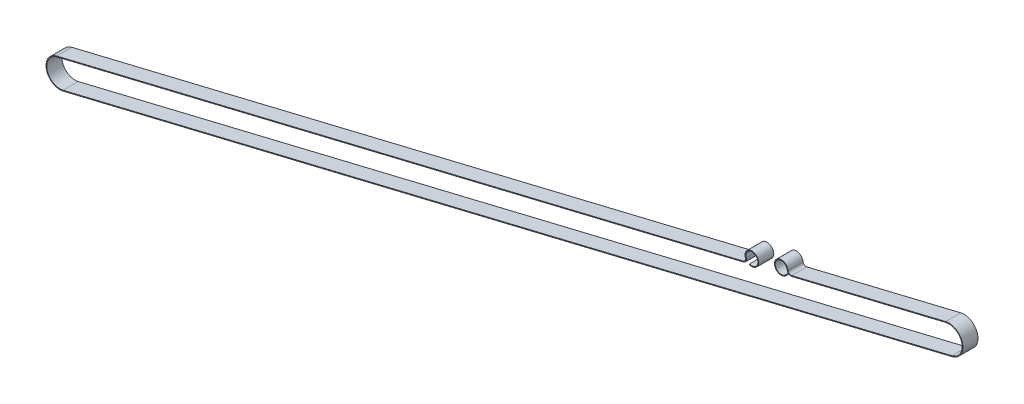
ISO-10303-21;
HEADER;
FILE_DESCRIPTION(('STEP AP214'),'2;1');
FILE_NAME('part.step','',(''),(''),'','','');
FILE_SCHEMA(('AUTOMOTIVE_DESIGN { 1 0 10303 214 1 1 1 1 }'));
ENDSEC;
DATA;
#1=APPLICATION_CONTEXT('core data for automotive mechanical design processes');
#2=APPLICATION_PROTOCOL_DEFINITION('international standard','automotive_design',2000,#1);
#3=PRODUCT_CONTEXT('',#1,'mechanical');
#4=PRODUCT('Part','Part','',(#3));
#5=PRODUCT_RELATED_PRODUCT_CATEGORY('part','',(#4));
#6=PRODUCT_DEFINITION_FORMATION('','',#4);
#7=PRODUCT_DEFINITION_CONTEXT('part definition',#1,'design');
#8=PRODUCT_DEFINITION('design','',#6,#7);
#9=PRODUCT_DEFINITION_SHAPE('','',#8);
#10=(LENGTH_UNIT() NAMED_UNIT(*) SI_UNIT(.MILLI.,.METRE.));
#11=(NAMED_UNIT(*) PLANE_ANGLE_UNIT() SI_UNIT($,.RADIAN.));
#12=(NAMED_UNIT(*) SI_UNIT($,.STERADIAN.) SOLID_ANGLE_UNIT());
#13=UNCERTAINTY_MEASURE_WITH_UNIT(LENGTH_MEASURE(1.E-05),#10,'distance_accuracy_value','');
#14=(GEOMETRIC_REPRESENTATION_CONTEXT(3) GLOBAL_UNCERTAINTY_ASSIGNED_CONTEXT((#13)) GLOBAL_UNIT_ASSIGNED_CONTEXT((#10,
#11,#12)) REPRESENTATION_CONTEXT('',''));
#15=CARTESIAN_POINT('',(0.,0.,0.));
#16=DIRECTION('',(0.,0.,1.));
#17=DIRECTION('',(1.,0.,0.));
#18=AXIS2_PLACEMENT_3D('',#15,#16,#17);
#19=CARTESIAN_POINT('',(954.384756553656,254.977852296044,20.));
#20=DIRECTION('',(0.,0.,-1.));
#21=DIRECTION('',(-1.,0.,0.));
#22=AXIS2_PLACEMENT_3D('',#19,#20,#21);
#23=CYLINDRICAL_SURFACE('',#22,8.99999999999999);
#24=CARTESIAN_POINT('',(954.384756553656,254.977852296044,0.));
#25=DIRECTION('',(0.,0.,1.));
#26=DIRECTION('',(1.,0.,0.));
#27=AXIS2_PLACEMENT_3D('',#24,#25,#26);
#28=CIRCLE('',#27,8.99999999999999);
#29=CARTESIAN_POINT('',(963.318813628938,256.065337549094,0.));
#30=VERTEX_POINT('',#29);
#31=CARTESIAN_POINT('',(961.200277560207,249.100040338413,0.));
#32=VERTEX_POINT('',#31);
#33=EDGE_CURVE('E202',#30,#32,#28,.T.);
#34=ORIENTED_EDGE('',*,*,#33,.T.);
#35=DIRECTION('',(0.,0.,-1.));
#36=VECTOR('',#35,1.);
#37=CARTESIAN_POINT('',(961.200277560207,249.100040338413,20.));
#38=LINE('',#37,#36);
#39=CARTESIAN_POINT('',(961.200277560207,249.100040338413,20.));
#40=VERTEX_POINT('',#39);
#41=EDGE_CURVE('E11',#40,#32,#38,.T.);
#42=ORIENTED_EDGE('',*,*,#41,.F.);
#43=CARTESIAN_POINT('',(954.384756553656,254.977852296044,20.));
#44=DIRECTION('',(0.,0.,1.));
#45=DIRECTION('',(1.,0.,0.));
#46=AXIS2_PLACEMENT_3D('',#43,#44,#45);
#47=CIRCLE('',#46,8.99999999999999);
#48=CARTESIAN_POINT('',(963.318813628938,256.065337549094,20.));
#49=VERTEX_POINT('',#48);
#50=EDGE_CURVE('E127',#49,#40,#47,.T.);
#51=ORIENTED_EDGE('',*,*,#50,.F.);
#52=DIRECTION('',(0.,0.,-1.));
#53=VECTOR('',#52,1.);
#54=CARTESIAN_POINT('',(963.318813628938,256.065337549094,20.));
#55=LINE('',#54,#53);
#56=EDGE_CURVE('E198',#49,#30,#55,.T.);
#57=ORIENTED_EDGE('',*,*,#56,.T.);
#58=EDGE_LOOP('',(#34,#42,#51,#57));
#59=FACE_BOUND('',#58,.T.);
#60=ADVANCED_FACE('F35',(#59),#23,.T.);
#61=CARTESIAN_POINT('',(960.442997448368,249.753130555928,20.));
#62=DIRECTION('',(0.653090217514445,0.757280111839031,0.));
#63=DIRECTION('',(-0.757280111839031,0.653090217514445,0.));
#64=AXIS2_PLACEMENT_3D('',#61,#62,#63);
#65=PLANE('',#64);
#66=DIRECTION('',(0.757280111839031,-0.653090217514445,0.));
#67=VECTOR('',#66,1.);
#68=CARTESIAN_POINT('',(960.442997448368,249.753130555928,0.));
#69=LINE('',#68,#67);
#70=CARTESIAN_POINT('',(960.442997448368,249.753130555928,0.));
#71=VERTEX_POINT('',#70);
#72=EDGE_CURVE('E205',#71,#32,#69,.T.);
#73=ORIENTED_EDGE('',*,*,#72,.F.);
#74=DIRECTION('',(0.,0.,-1.));
#75=VECTOR('',#74,1.);
#76=CARTESIAN_POINT('',(960.442997448368,249.753130555928,20.));
#77=LINE('',#76,#75);
#78=CARTESIAN_POINT('',(960.442997448368,249.753130555928,20.));
#79=VERTEX_POINT('',#78);
#80=EDGE_CURVE('E43',#79,#71,#77,.T.);
#81=ORIENTED_EDGE('',*,*,#80,.F.);
#82=DIRECTION('',(0.757280111839031,-0.653090217514445,0.));
#83=VECTOR('',#82,1.);
#84=CARTESIAN_POINT('',(960.442997448368,249.753130555928,20.));
#85=LINE('',#84,#83);
#86=EDGE_CURVE('E307',#79,#40,#85,.T.);
#87=ORIENTED_EDGE('',*,*,#86,.T.);
#88=ORIENTED_EDGE('',*,*,#41,.T.);
#89=EDGE_LOOP('',(#73,#81,#87,#88));
#90=FACE_BOUND('',#89,.T.);
#91=ADVANCED_FACE('F294',(#90),#65,.T.);
#92=CARTESIAN_POINT('',(954.384756553656,254.977852296044,20.));
#93=DIRECTION('',(0.,0.,-1.));
#94=DIRECTION('',(-1.,0.,0.));
#95=AXIS2_PLACEMENT_3D('',#92,#93,#94);
#96=CYLINDRICAL_SURFACE('',#95,7.99999999999999);
#97=CARTESIAN_POINT('',(954.384756553656,254.977852296044,0.));
#98=DIRECTION('',(0.,0.,1.));
#99=DIRECTION('',(1.,0.,0.));
#100=AXIS2_PLACEMENT_3D('',#97,#98,#99);
#101=CIRCLE('',#100,7.99999999999999);
#102=CARTESIAN_POINT('',(962.326140620573,255.944505854311,0.));
#103=VERTEX_POINT('',#102);
#104=EDGE_CURVE('E208',#103,#71,#101,.T.);
#105=ORIENTED_EDGE('',*,*,#104,.F.);
#106=DIRECTION('',(0.,0.,-1.));
#107=VECTOR('',#106,1.);
#108=CARTESIAN_POINT('',(962.326140620573,255.944505854311,20.));
#109=LINE('',#108,#107);
#110=CARTESIAN_POINT('',(962.326140620573,255.944505854311,20.));
#111=VERTEX_POINT('',#110);
#112=EDGE_CURVE('E284',#111,#103,#109,.T.);
#113=ORIENTED_EDGE('',*,*,#112,.F.);
#114=CARTESIAN_POINT('',(954.384756553656,254.977852296044,20.));
#115=DIRECTION('',(0.,0.,1.));
#116=DIRECTION('',(1.,0.,0.));
#117=AXIS2_PLACEMENT_3D('',#114,#115,#116);
#118=CIRCLE('',#117,7.99999999999999);
#119=EDGE_CURVE('E291',#111,#79,#118,.T.);
#120=ORIENTED_EDGE('',*,*,#119,.T.);
#121=ORIENTED_EDGE('',*,*,#80,.T.);
#122=EDGE_LOOP('',(#105,#113,#120,#121));
#123=FACE_BOUND('',#122,.T.);
#124=ADVANCED_FACE('F289',(#123),#96,.F.);
#125=CARTESIAN_POINT('',(967.289505662396,256.548664328228,20.));
#126=DIRECTION('',(0.,0.,-1.));
#127=DIRECTION('',(-1.,0.,0.));
#128=AXIS2_PLACEMENT_3D('',#125,#126,#127);
#129=CYLINDRICAL_SURFACE('',#128,5.00000000000005);
#130=CARTESIAN_POINT('',(967.289505662396,256.548664328228,0.));
#131=DIRECTION('',(0.,0.,-1.));
#132=DIRECTION('',(1.,0.,0.));
#133=AXIS2_PLACEMENT_3D('',#130,#131,#132);
#134=CIRCLE('',#133,5.00000000000005);
#135=CARTESIAN_POINT('',(968.462324861558,251.688160740525,0.));
#136=VERTEX_POINT('',#135);
#137=EDGE_CURVE('E211',#136,#103,#134,.T.);
#138=ORIENTED_EDGE('',*,*,#137,.F.);
#139=DIRECTION('',(0.,0.,-1.));
#140=VECTOR('',#139,1.);
#141=CARTESIAN_POINT('',(968.462324861558,251.688160740525,20.));
#142=LINE('',#141,#140);
#143=CARTESIAN_POINT('',(968.462324861558,251.688160740525,20.));
#144=VERTEX_POINT('',#143);
#145=EDGE_CURVE('E282',#144,#136,#142,.T.);
#146=ORIENTED_EDGE('',*,*,#145,.F.);
#147=CARTESIAN_POINT('',(967.289505662396,256.548664328228,20.));
#148=DIRECTION('',(0.,0.,-1.));
#149=DIRECTION('',(1.,0.,0.));
#150=AXIS2_PLACEMENT_3D('',#147,#148,#149);
#151=CIRCLE('',#150,5.00000000000005);
#152=EDGE_CURVE('E304',#144,#111,#151,.T.);
#153=ORIENTED_EDGE('',*,*,#152,.T.);
#154=ORIENTED_EDGE('',*,*,#112,.T.);
#155=EDGE_LOOP('',(#138,#146,#153,#154));
#156=FACE_BOUND('',#155,.T.);
#157=ADVANCED_FACE('F301',(#156),#129,.T.);
#158=CARTESIAN_POINT('',(1172.1370010272,300.834008753949,20.));
#159=DIRECTION('',(0.234563839832222,-0.97210071754071,0.));
#160=DIRECTION('',(0.97210071754071,0.234563839832222,0.));
#161=AXIS2_PLACEMENT_3D('',#158,#159,#160);
#162=PLANE('',#161);
#163=DIRECTION('',(-0.97210071754071,-0.234563839832222,0.));
#164=VECTOR('',#163,1.);
#165=CARTESIAN_POINT('',(1172.1370010272,300.834008753949,0.));
#166=LINE('',#165,#164);
#167=CARTESIAN_POINT('',(1172.1370010272,300.834008753949,0.));
#168=VERTEX_POINT('',#167);
#169=EDGE_CURVE('E214',#168,#136,#166,.T.);
#170=ORIENTED_EDGE('',*,*,#169,.F.);
#171=DIRECTION('',(0.,0.,-1.));
#172=VECTOR('',#171,1.);
#173=CARTESIAN_POINT('',(1172.1370010272,300.834008753949,20.));
#174=LINE('',#173,#172);
#175=CARTESIAN_POINT('',(1172.1370010272,300.834008753949,20.));
#176=VERTEX_POINT('',#175);
#177=EDGE_CURVE('E280',#176,#168,#174,.T.);
#178=ORIENTED_EDGE('',*,*,#177,.F.);
#179=DIRECTION('',(-0.97210071754071,-0.234563839832222,0.));
#180=VECTOR('',#179,1.);
#181=CARTESIAN_POINT('',(1172.1370010272,300.834008753949,20.));
#182=LINE('',#181,#180);
#183=EDGE_CURVE('E309',#176,#144,#182,.T.);
#184=ORIENTED_EDGE('',*,*,#183,.T.);
#185=ORIENTED_EDGE('',*,*,#145,.T.);
#186=EDGE_LOOP('',(#170,#178,#184,#185));
#187=FACE_BOUND('',#186,.T.);
#188=ADVANCED_FACE('F375',(#187),#162,.T.);
#189=CARTESIAN_POINT('',(1176.24186822426,283.822246196986,20.));
#190=DIRECTION('',(0.,0.,-1.));
#191=DIRECTION('',(-1.,0.,0.));
#192=AXIS2_PLACEMENT_3D('',#189,#190,#191);
#193=CYLINDRICAL_SURFACE('',#192,17.5);
#194=CARTESIAN_POINT('',(1176.24186822426,283.822246196986,0.));
#195=DIRECTION('',(0.,0.,1.));
#196=DIRECTION('',(1.,0.,0.));
#197=AXIS2_PLACEMENT_3D('',#194,#195,#196);
#198=CIRCLE('',#197,17.5);
#199=CARTESIAN_POINT('',(1180.34673542132,266.810483640024,0.));
#200=VERTEX_POINT('',#199);
#201=EDGE_CURVE('E217',#200,#168,#198,.T.);
#202=ORIENTED_EDGE('',*,*,#201,.F.);
#203=DIRECTION('',(0.,0.,-1.));
#204=VECTOR('',#203,1.);
#205=CARTESIAN_POINT('',(1180.34673542132,266.810483640024,20.));
#206=LINE('',#205,#204);
#207=CARTESIAN_POINT('',(1180.34673542132,266.810483640024,20.));
#208=VERTEX_POINT('',#207);
#209=EDGE_CURVE('E278',#208,#200,#206,.T.);
#210=ORIENTED_EDGE('',*,*,#209,.F.);
#211=CARTESIAN_POINT('',(1176.24186822426,283.822246196986,20.));
#212=DIRECTION('',(0.,0.,1.));
#213=DIRECTION('',(1.,0.,0.));
#214=AXIS2_PLACEMENT_3D('',#211,#212,#213);
#215=CIRCLE('',#214,17.5);
#216=EDGE_CURVE('E315',#208,#176,#215,.T.);
#217=ORIENTED_EDGE('',*,*,#216,.T.);
#218=ORIENTED_EDGE('',*,*,#177,.T.);
#219=EDGE_LOOP('',(#202,#210,#217,#218));
#220=FACE_BOUND('',#219,.T.);
#221=ADVANCED_FACE('F378',(#220),#193,.F.);
#222=CARTESIAN_POINT('',(1180.34673542132,266.810483640024,20.));
#223=DIRECTION('',(-0.23456383983222,0.972100717540711,0.));
#224=DIRECTION('',(-0.972100717540711,-0.23456383983222,0.));
#225=AXIS2_PLACEMENT_3D('',#222,#223,#224);
#226=PLANE('',#225);
#227=DIRECTION('',(0.972100717540711,0.23456383983222,0.));
#228=VECTOR('',#227,1.);
#229=CARTESIAN_POINT('',(1180.34673542132,266.810483640024,0.));
#230=LINE('',#229,#228);
#231=CARTESIAN_POINT('',(4.10486719706377,-17.0117625569625,0.));
#232=VERTEX_POINT('',#231);
#233=EDGE_CURVE('E220',#232,#200,#230,.T.);
#234=ORIENTED_EDGE('',*,*,#233,.F.);
#235=DIRECTION('',(0.,0.,-1.));
#236=VECTOR('',#235,1.);
#237=CARTESIAN_POINT('',(4.10486719706377,-17.0117625569625,20.));
#238=LINE('',#237,#236);
#239=CARTESIAN_POINT('',(4.10486719706377,-17.0117625569625,20.));
#240=VERTEX_POINT('',#239);
#241=EDGE_CURVE('E276',#240,#232,#238,.T.);
#242=ORIENTED_EDGE('',*,*,#241,.F.);
#243=DIRECTION('',(0.972100717540711,0.23456383983222,0.));
#244=VECTOR('',#243,1.);
#245=CARTESIAN_POINT('',(1180.34673542132,266.810483640024,20.));
#246=LINE('',#245,#244);
#247=EDGE_CURVE('E318',#240,#208,#246,.T.);
#248=ORIENTED_EDGE('',*,*,#247,.T.);
#249=ORIENTED_EDGE('',*,*,#209,.T.);
#250=EDGE_LOOP('',(#234,#242,#248,#249));
#251=FACE_BOUND('',#250,.T.);
#252=ADVANCED_FACE('F382',(#251),#226,.T.);
#253=CARTESIAN_POINT('',(-1.11022302462516E-13,0.,20.));
#254=DIRECTION('',(0.,0.,-1.));
#255=DIRECTION('',(-1.,0.,0.));
#256=AXIS2_PLACEMENT_3D('',#253,#254,#255);
#257=CYLINDRICAL_SURFACE('',#256,17.5);
#258=CARTESIAN_POINT('',(-1.11022302462516E-13,0.,0.));
#259=DIRECTION('',(0.,0.,1.));
#260=DIRECTION('',(1.,0.,0.));
#261=AXIS2_PLACEMENT_3D('',#258,#259,#260);
#262=CIRCLE('',#261,17.5);
#263=CARTESIAN_POINT('',(-4.10486719706398,17.0117625569625,0.));
#264=VERTEX_POINT('',#263);
#265=EDGE_CURVE('E223',#264,#232,#262,.T.);
#266=ORIENTED_EDGE('',*,*,#265,.F.);
#267=DIRECTION('',(0.,0.,-1.));
#268=VECTOR('',#267,1.);
#269=CARTESIAN_POINT('',(-4.10486719706398,17.0117625569625,20.));
#270=LINE('',#269,#268);
#271=CARTESIAN_POINT('',(-4.10486719706398,17.0117625569625,20.));
#272=VERTEX_POINT('',#271);
#273=EDGE_CURVE('E274',#272,#264,#270,.T.);
#274=ORIENTED_EDGE('',*,*,#273,.F.);
#275=CARTESIAN_POINT('',(-1.11022302462516E-13,0.,20.));
#276=DIRECTION('',(0.,0.,1.));
#277=DIRECTION('',(1.,0.,0.));
#278=AXIS2_PLACEMENT_3D('',#275,#276,#277);
#279=CIRCLE('',#278,17.5);
#280=EDGE_CURVE('E321',#272,#240,#279,.T.);
#281=ORIENTED_EDGE('',*,*,#280,.T.);
#282=ORIENTED_EDGE('',*,*,#241,.T.);
#283=EDGE_LOOP('',(#266,#274,#281,#282));
#284=FACE_BOUND('',#283,.T.);
#285=ADVANCED_FACE('F386',(#284),#257,.F.);
#286=CARTESIAN_POINT('',(904.472489461667,236.247680931393,20.));
#287=DIRECTION('',(0.23456383983222,-0.972100717540711,0.));
#288=DIRECTION('',(0.972100717540711,0.23456383983222,0.));
#289=AXIS2_PLACEMENT_3D('',#286,#287,#288);
#290=PLANE('',#289);
#291=DIRECTION('',(-0.972100717540711,-0.23456383983222,0.));
#292=VECTOR('',#291,1.);
#293=CARTESIAN_POINT('',(904.472489461667,236.247680931393,0.));
#294=LINE('',#293,#292);
#295=CARTESIAN_POINT('',(904.472489461667,236.247680931393,0.));
#296=VERTEX_POINT('',#295);
#297=EDGE_CURVE('E226',#296,#264,#294,.T.);
#298=ORIENTED_EDGE('',*,*,#297,.F.);
#299=DIRECTION('',(0.,0.,-1.));
#300=VECTOR('',#299,1.);
#301=CARTESIAN_POINT('',(904.472489461667,236.247680931393,20.));
#302=LINE('',#301,#300);
#303=CARTESIAN_POINT('',(904.472489461667,236.247680931393,20.));
#304=VERTEX_POINT('',#303);
#305=EDGE_CURVE('E272',#304,#296,#302,.T.);
#306=ORIENTED_EDGE('',*,*,#305,.F.);
#307=DIRECTION('',(-0.972100717540711,-0.23456383983222,0.));
#308=VECTOR('',#307,1.);
#309=CARTESIAN_POINT('',(904.472489461667,236.247680931393,20.));
#310=LINE('',#309,#308);
#311=EDGE_CURVE('E324',#304,#272,#310,.T.);
#312=ORIENTED_EDGE('',*,*,#311,.T.);
#313=ORIENTED_EDGE('',*,*,#273,.T.);
#314=EDGE_LOOP('',(#298,#306,#312,#313));
#315=FACE_BOUND('',#314,.T.);
#316=ADVANCED_FACE('F390',(#315),#290,.T.);
#317=CARTESIAN_POINT('',(903.299670262506,241.108184519096,20.));
#318=DIRECTION('',(0.,0.,-1.));
#319=DIRECTION('',(-1.,0.,0.));
#320=AXIS2_PLACEMENT_3D('',#317,#318,#319);
#321=CYLINDRICAL_SURFACE('',#320,5.00000000000004);
#322=CARTESIAN_POINT('',(903.299670262506,241.108184519096,0.));
#323=DIRECTION('',(0.,0.,-1.));
#324=DIRECTION('',(-1.,0.,0.));
#325=AXIS2_PLACEMENT_3D('',#322,#323,#324);
#326=CIRCLE('',#325,5.00000000000004);
#327=CARTESIAN_POINT('',(907.992384720014,242.833997666657,0.));
#328=VERTEX_POINT('',#327);
#329=EDGE_CURVE('E229',#328,#296,#326,.T.);
#330=ORIENTED_EDGE('',*,*,#329,.F.);
#331=DIRECTION('',(0.,0.,-1.));
#332=VECTOR('',#331,1.);
#333=CARTESIAN_POINT('',(907.992384720014,242.833997666657,20.));
#334=LINE('',#333,#332);
#335=CARTESIAN_POINT('',(907.992384720014,242.833997666657,20.));
#336=VERTEX_POINT('',#335);
#337=EDGE_CURVE('E270',#336,#328,#334,.T.);
#338=ORIENTED_EDGE('',*,*,#337,.F.);
#339=CARTESIAN_POINT('',(903.299670262506,241.108184519096,20.));
#340=DIRECTION('',(0.,0.,-1.));
#341=DIRECTION('',(-1.,0.,0.));
#342=AXIS2_PLACEMENT_3D('',#339,#340,#341);
#343=CIRCLE('',#342,5.00000000000004);
#344=EDGE_CURVE('E327',#336,#304,#343,.T.);
#345=ORIENTED_EDGE('',*,*,#344,.T.);
#346=ORIENTED_EDGE('',*,*,#305,.T.);
#347=EDGE_LOOP('',(#330,#338,#345,#346));
#348=FACE_BOUND('',#347,.T.);
#349=ADVANCED_FACE('F394',(#348),#321,.T.);
#350=CARTESIAN_POINT('',(915.500727852027,245.595298702755,20.));
#351=DIRECTION('',(0.,0.,-1.));
#352=DIRECTION('',(-1.,0.,0.));
#353=AXIS2_PLACEMENT_3D('',#350,#351,#352);
#354=CYLINDRICAL_SURFACE('',#353,7.99999999999997);
#355=CARTESIAN_POINT('',(915.500727852027,245.595298702755,0.));
#356=DIRECTION('',(0.,0.,1.));
#357=DIRECTION('',(1.,0.,0.));
#358=AXIS2_PLACEMENT_3D('',#355,#356,#357);
#359=CIRCLE('',#358,7.99999999999997);
#360=CARTESIAN_POINT('',(912.491816874857,238.18271111599,0.));
#361=VERTEX_POINT('',#360);
#362=EDGE_CURVE('E232',#361,#328,#359,.T.);
#363=ORIENTED_EDGE('',*,*,#362,.F.);
#364=DIRECTION('',(0.,0.,-1.));
#365=VECTOR('',#364,1.);
#366=CARTESIAN_POINT('',(912.491816874857,238.18271111599,20.));
#367=LINE('',#366,#365);
#368=CARTESIAN_POINT('',(912.491816874857,238.18271111599,20.));
#369=VERTEX_POINT('',#368);
#370=EDGE_CURVE('E268',#369,#361,#367,.T.);
#371=ORIENTED_EDGE('',*,*,#370,.F.);
#372=CARTESIAN_POINT('',(915.500727852027,245.595298702755,20.));
#373=DIRECTION('',(0.,0.,1.));
#374=DIRECTION('',(1.,0.,0.));
#375=AXIS2_PLACEMENT_3D('',#372,#373,#374);
#376=CIRCLE('',#375,7.99999999999997);
#377=EDGE_CURVE('E330',#369,#336,#376,.T.);
#378=ORIENTED_EDGE('',*,*,#377,.T.);
#379=ORIENTED_EDGE('',*,*,#337,.T.);
#380=EDGE_LOOP('',(#363,#371,#378,#379));
#381=FACE_BOUND('',#380,.T.);
#382=ADVANCED_FACE('F398',(#381),#354,.F.);
#383=CARTESIAN_POINT('',(912.115703002711,237.256137667644,20.));
#384=DIRECTION('',(-0.926573448345632,0.376113872146302,0.));
#385=DIRECTION('',(-0.376113872146302,-0.926573448345632,0.));
#386=AXIS2_PLACEMENT_3D('',#383,#384,#385);
#387=PLANE('',#386);
#388=DIRECTION('',(0.376113872146302,0.926573448345631,0.));
#389=VECTOR('',#388,1.);
#390=CARTESIAN_POINT('',(912.115703002711,237.256137667644,0.));
#391=LINE('',#390,#389);
#392=CARTESIAN_POINT('',(912.115703002711,237.256137667644,0.));
#393=VERTEX_POINT('',#392);
#394=EDGE_CURVE('E235',#393,#361,#391,.T.);
#395=ORIENTED_EDGE('',*,*,#394,.F.);
#396=DIRECTION('',(0.,0.,-1.));
#397=VECTOR('',#396,1.);
#398=CARTESIAN_POINT('',(912.115703002711,237.256137667644,20.));
#399=LINE('',#398,#397);
#400=CARTESIAN_POINT('',(912.115703002711,237.256137667644,20.));
#401=VERTEX_POINT('',#400);
#402=EDGE_CURVE('E266',#401,#393,#399,.T.);
#403=ORIENTED_EDGE('',*,*,#402,.F.);
#404=DIRECTION('',(0.376113872146302,0.926573448345631,0.));
#405=VECTOR('',#404,1.);
#406=CARTESIAN_POINT('',(912.115703002711,237.256137667644,20.));
#407=LINE('',#406,#405);
#408=EDGE_CURVE('E333',#401,#369,#407,.T.);
#409=ORIENTED_EDGE('',*,*,#408,.T.);
#410=ORIENTED_EDGE('',*,*,#370,.T.);
#411=EDGE_LOOP('',(#395,#403,#409,#410));
#412=FACE_BOUND('',#411,.T.);
#413=ADVANCED_FACE('F402',(#412),#387,.T.);
#414=CARTESIAN_POINT('',(915.500727852027,245.595298702755,20.));
#415=DIRECTION('',(0.,0.,-1.));
#416=DIRECTION('',(-1.,0.,0.));
#417=AXIS2_PLACEMENT_3D('',#414,#415,#416);
#418=CYLINDRICAL_SURFACE('',#417,8.99999999999997);
#419=CARTESIAN_POINT('',(915.500727852027,245.595298702755,0.));
#420=DIRECTION('',(0.,0.,1.));
#421=DIRECTION('',(1.,0.,0.));
#422=AXIS2_PLACEMENT_3D('',#419,#420,#421);
#423=CIRCLE('',#422,8.99999999999997);
#424=CARTESIAN_POINT('',(907.053841828513,242.488835037145,0.));
#425=VERTEX_POINT('',#424);
#426=EDGE_CURVE('E238',#393,#425,#423,.T.);
#427=ORIENTED_EDGE('',*,*,#426,.T.);
#428=DIRECTION('',(0.,0.,-1.));
#429=VECTOR('',#428,1.);
#430=CARTESIAN_POINT('',(907.053841828513,242.488835037145,20.));
#431=LINE('',#430,#429);
#432=CARTESIAN_POINT('',(907.053841828513,242.488835037145,20.));
#433=VERTEX_POINT('',#432);
#434=EDGE_CURVE('E263',#433,#425,#431,.T.);
#435=ORIENTED_EDGE('',*,*,#434,.F.);
#436=CARTESIAN_POINT('',(915.500727852027,245.595298702755,20.));
#437=DIRECTION('',(0.,0.,1.));
#438=DIRECTION('',(1.,0.,0.));
#439=AXIS2_PLACEMENT_3D('',#436,#437,#438);
#440=CIRCLE('',#439,8.99999999999997);
#441=EDGE_CURVE('E336',#401,#433,#440,.T.);
#442=ORIENTED_EDGE('',*,*,#441,.F.);
#443=ORIENTED_EDGE('',*,*,#402,.T.);
#444=EDGE_LOOP('',(#427,#435,#442,#443));
#445=FACE_BOUND('',#444,.T.);
#446=ADVANCED_FACE('F406',(#445),#418,.T.);
#447=CARTESIAN_POINT('',(903.299670262506,241.108184519096,20.));
#448=DIRECTION('',(0.,0.,-1.));
#449=DIRECTION('',(-1.,0.,0.));
#450=AXIS2_PLACEMENT_3D('',#447,#448,#449);
#451=CYLINDRICAL_SURFACE('',#450,4.00000000000004);
#452=CARTESIAN_POINT('',(903.299670262506,241.108184519096,0.));
#453=DIRECTION('',(0.,0.,1.));
#454=DIRECTION('',(1.,0.,0.));
#455=AXIS2_PLACEMENT_3D('',#452,#453,#454);
#456=CIRCLE('',#455,4.00000000000004);
#457=CARTESIAN_POINT('',(904.237925621835,237.219781648933,0.));
#458=VERTEX_POINT('',#457);
#459=EDGE_CURVE('E240',#425,#458,#456,.F.);
#460=ORIENTED_EDGE('',*,*,#459,.T.);
#461=DIRECTION('',(0.,0.,-1.));
#462=VECTOR('',#461,1.);
#463=CARTESIAN_POINT('',(904.237925621835,237.219781648933,20.));
#464=LINE('',#463,#462);
#465=CARTESIAN_POINT('',(904.237925621835,237.219781648933,20.));
#466=VERTEX_POINT('',#465);
#467=EDGE_CURVE('E260',#466,#458,#464,.T.);
#468=ORIENTED_EDGE('',*,*,#467,.F.);
#469=CARTESIAN_POINT('',(903.299670262506,241.108184519096,20.));
#470=DIRECTION('',(0.,0.,1.));
#471=DIRECTION('',(1.,0.,0.));
#472=AXIS2_PLACEMENT_3D('',#469,#470,#471);
#473=CIRCLE('',#472,4.00000000000004);
#474=EDGE_CURVE('E338',#433,#466,#473,.F.);
#475=ORIENTED_EDGE('',*,*,#474,.F.);
#476=ORIENTED_EDGE('',*,*,#434,.T.);
#477=EDGE_LOOP('',(#460,#468,#475,#476));
#478=FACE_BOUND('',#477,.T.);
#479=ADVANCED_FACE('F410',(#478),#451,.F.);
#480=CARTESIAN_POINT('',(904.237925621835,237.219781648933,20.));
#481=DIRECTION('',(0.23456383983222,-0.972100717540711,0.));
#482=DIRECTION('',(0.972100717540711,0.23456383983222,0.));
#483=AXIS2_PLACEMENT_3D('',#480,#481,#482);
#484=PLANE('',#483);
#485=DIRECTION('',(-0.972100717540711,-0.23456383983222,0.));
#486=VECTOR('',#485,1.);
#487=CARTESIAN_POINT('',(904.237925621835,237.219781648933,0.));
#488=LINE('',#487,#486);
#489=CARTESIAN_POINT('',(-4.3394310368962,17.9838632745032,0.));
#490=VERTEX_POINT('',#489);
#491=EDGE_CURVE('E242',#458,#490,#488,.T.);
#492=ORIENTED_EDGE('',*,*,#491,.T.);
#493=DIRECTION('',(0.,0.,-1.));
#494=VECTOR('',#493,1.);
#495=CARTESIAN_POINT('',(-4.3394310368962,17.9838632745032,20.));
#496=LINE('',#495,#494);
#497=CARTESIAN_POINT('',(-4.3394310368962,17.9838632745032,20.));
#498=VERTEX_POINT('',#497);
#499=EDGE_CURVE('E257',#498,#490,#496,.T.);
#500=ORIENTED_EDGE('',*,*,#499,.F.);
#501=DIRECTION('',(-0.972100717540711,-0.23456383983222,0.));
#502=VECTOR('',#501,1.);
#503=CARTESIAN_POINT('',(904.237925621835,237.219781648933,20.));
#504=LINE('',#503,#502);
#505=EDGE_CURVE('E340',#466,#498,#504,.T.);
#506=ORIENTED_EDGE('',*,*,#505,.F.);
#507=ORIENTED_EDGE('',*,*,#467,.T.);
#508=EDGE_LOOP('',(#492,#500,#506,#507));
#509=FACE_BOUND('',#508,.T.);
#510=ADVANCED_FACE('F414',(#509),#484,.F.);
#511=CARTESIAN_POINT('',(-1.11022302462516E-13,0.,20.));
#512=DIRECTION('',(0.,0.,-1.));
#513=DIRECTION('',(-1.,0.,0.));
#514=AXIS2_PLACEMENT_3D('',#511,#512,#513);
#515=CYLINDRICAL_SURFACE('',#514,18.5);
#516=CARTESIAN_POINT('',(-1.11022302462516E-13,0.,0.));
#517=DIRECTION('',(0.,0.,1.));
#518=DIRECTION('',(1.,0.,0.));
#519=AXIS2_PLACEMENT_3D('',#516,#517,#518);
#520=CIRCLE('',#519,18.5);
#521=CARTESIAN_POINT('',(4.33943103689605,-17.9838632745032,0.));
#522=VERTEX_POINT('',#521);
#523=EDGE_CURVE('E244',#490,#522,#520,.T.);
#524=ORIENTED_EDGE('',*,*,#523,.T.);
#525=DIRECTION('',(0.,0.,-1.));
#526=VECTOR('',#525,1.);
#527=CARTESIAN_POINT('',(4.33943103689605,-17.9838632745032,20.));
#528=LINE('',#527,#526);
#529=CARTESIAN_POINT('',(4.33943103689605,-17.9838632745032,20.));
#530=VERTEX_POINT('',#529);
#531=EDGE_CURVE('E254',#530,#522,#528,.T.);
#532=ORIENTED_EDGE('',*,*,#531,.F.);
#533=CARTESIAN_POINT('',(-1.11022302462516E-13,0.,20.));
#534=DIRECTION('',(0.,0.,1.));
#535=DIRECTION('',(1.,0.,0.));
#536=AXIS2_PLACEMENT_3D('',#533,#534,#535);
#537=CIRCLE('',#536,18.5);
#538=EDGE_CURVE('E342',#498,#530,#537,.T.);
#539=ORIENTED_EDGE('',*,*,#538,.F.);
#540=ORIENTED_EDGE('',*,*,#499,.T.);
#541=EDGE_LOOP('',(#524,#532,#539,#540));
#542=FACE_BOUND('',#541,.T.);
#543=ADVANCED_FACE('F348',(#542),#515,.T.);
#544=CARTESIAN_POINT('',(1180.58129926116,265.838382922483,20.));
#545=DIRECTION('',(-0.23456383983222,0.972100717540711,0.));
#546=DIRECTION('',(-0.972100717540711,-0.23456383983222,0.));
#547=AXIS2_PLACEMENT_3D('',#544,#545,#546);
#548=PLANE('',#547);
#549=DIRECTION('',(0.972100717540711,0.23456383983222,0.));
#550=VECTOR('',#549,1.);
#551=CARTESIAN_POINT('',(1180.58129926116,265.838382922483,0.));
#552=LINE('',#551,#550);
#553=CARTESIAN_POINT('',(1180.58129926116,265.838382922483,0.));
#554=VERTEX_POINT('',#553);
#555=EDGE_CURVE('E246',#522,#554,#552,.T.);
#556=ORIENTED_EDGE('',*,*,#555,.T.);
#557=DIRECTION('',(0.,0.,-1.));
#558=VECTOR('',#557,1.);
#559=CARTESIAN_POINT('',(1180.58129926116,265.838382922483,20.));
#560=LINE('',#559,#558);
#561=CARTESIAN_POINT('',(1180.58129926116,265.838382922483,20.));
#562=VERTEX_POINT('',#561);
#563=EDGE_CURVE('E193',#562,#554,#560,.T.);
#564=ORIENTED_EDGE('',*,*,#563,.F.);
#565=DIRECTION('',(0.972100717540711,0.23456383983222,0.));
#566=VECTOR('',#565,1.);
#567=CARTESIAN_POINT('',(1180.58129926116,265.838382922483,20.));
#568=LINE('',#567,#566);
#569=EDGE_CURVE('E184',#530,#562,#568,.T.);
#570=ORIENTED_EDGE('',*,*,#569,.F.);
#571=ORIENTED_EDGE('',*,*,#531,.T.);
#572=EDGE_LOOP('',(#556,#564,#570,#571));
#573=FACE_BOUND('',#572,.T.);
#574=ADVANCED_FACE('F352',(#573),#548,.F.);
#575=CARTESIAN_POINT('',(1176.24186822426,283.822246196986,20.));
#576=DIRECTION('',(0.,0.,-1.));
#577=DIRECTION('',(-1.,0.,0.));
#578=AXIS2_PLACEMENT_3D('',#575,#576,#577);
#579=CYLINDRICAL_SURFACE('',#578,18.5);
#580=CARTESIAN_POINT('',(1176.24186822426,283.822246196986,0.));
#581=DIRECTION('',(0.,0.,1.));
#582=DIRECTION('',(1.,0.,0.));
#583=AXIS2_PLACEMENT_3D('',#580,#581,#582);
#584=CIRCLE('',#583,18.5);
#585=CARTESIAN_POINT('',(1171.90243718736,301.80610947149,0.));
#586=VERTEX_POINT('',#585);
#587=EDGE_CURVE('E192',#554,#586,#584,.T.);
#588=ORIENTED_EDGE('',*,*,#587,.T.);
#589=DIRECTION('',(0.,0.,-1.));
#590=VECTOR('',#589,1.);
#591=CARTESIAN_POINT('',(1171.90243718736,301.80610947149,20.));
#592=LINE('',#591,#590);
#593=CARTESIAN_POINT('',(1171.90243718736,301.80610947149,20.));
#594=VERTEX_POINT('',#593);
#595=EDGE_CURVE('E189',#594,#586,#592,.T.);
#596=ORIENTED_EDGE('',*,*,#595,.F.);
#597=CARTESIAN_POINT('',(1176.24186822426,283.822246196986,20.));
#598=DIRECTION('',(0.,0.,1.));
#599=DIRECTION('',(1.,0.,0.));
#600=AXIS2_PLACEMENT_3D('',#597,#598,#599);
#601=CIRCLE('',#600,18.5);
#602=EDGE_CURVE('E178',#562,#594,#601,.T.);
#603=ORIENTED_EDGE('',*,*,#602,.F.);
#604=ORIENTED_EDGE('',*,*,#563,.T.);
#605=EDGE_LOOP('',(#588,#596,#603,#604));
#606=FACE_BOUND('',#605,.T.);
#607=ADVANCED_FACE('F190',(#606),#579,.T.);
#608=CARTESIAN_POINT('',(1171.90243718736,301.80610947149,20.));
#609=DIRECTION('',(0.234563839832222,-0.97210071754071,0.));
#610=DIRECTION('',(0.97210071754071,0.234563839832222,0.));
#611=AXIS2_PLACEMENT_3D('',#608,#609,#610);
#612=PLANE('',#611);
#613=DIRECTION('',(-0.97210071754071,-0.234563839832222,0.));
#614=VECTOR('',#613,1.);
#615=CARTESIAN_POINT('',(1171.90243718736,301.80610947149,0.));
#616=LINE('',#615,#614);
#617=CARTESIAN_POINT('',(968.227761021725,252.660261458065,0.));
#618=VERTEX_POINT('',#617);
#619=EDGE_CURVE('E115',#586,#618,#616,.T.);
#620=ORIENTED_EDGE('',*,*,#619,.T.);
#621=DIRECTION('',(0.,0.,-1.));
#622=VECTOR('',#621,1.);
#623=CARTESIAN_POINT('',(968.227761021725,252.660261458065,20.));
#624=LINE('',#623,#622);
#625=CARTESIAN_POINT('',(968.227761021725,252.660261458065,20.));
#626=VERTEX_POINT('',#625);
#627=EDGE_CURVE('E194',#626,#618,#624,.T.);
#628=ORIENTED_EDGE('',*,*,#627,.F.);
#629=DIRECTION('',(-0.97210071754071,-0.234563839832222,0.));
#630=VECTOR('',#629,1.);
#631=CARTESIAN_POINT('',(1171.90243718736,301.80610947149,20.));
#632=LINE('',#631,#630);
#633=EDGE_CURVE('E182',#594,#626,#632,.T.);
#634=ORIENTED_EDGE('',*,*,#633,.F.);
#635=ORIENTED_EDGE('',*,*,#595,.T.);
#636=EDGE_LOOP('',(#620,#628,#634,#635));
#637=FACE_BOUND('',#636,.T.);
#638=ADVANCED_FACE('F196',(#637),#612,.F.);
#639=CARTESIAN_POINT('',(967.289505662396,256.548664328228,20.));
#640=DIRECTION('',(0.,0.,-1.));
#641=DIRECTION('',(-1.,0.,0.));
#642=AXIS2_PLACEMENT_3D('',#639,#640,#641);
#643=CYLINDRICAL_SURFACE('',#642,4.00000000000005);
#644=CARTESIAN_POINT('',(967.289505662396,256.548664328228,0.));
#645=DIRECTION('',(0.,0.,1.));
#646=DIRECTION('',(1.,0.,0.));
#647=AXIS2_PLACEMENT_3D('',#644,#645,#646);
#648=CIRCLE('',#647,4.00000000000005);
#649=EDGE_CURVE('E121',#618,#30,#648,.F.);
#650=ORIENTED_EDGE('',*,*,#649,.T.);
#651=ORIENTED_EDGE('',*,*,#56,.F.);
#652=CARTESIAN_POINT('',(967.289505662396,256.548664328228,20.));
#653=DIRECTION('',(0.,0.,1.));
#654=DIRECTION('',(1.,0.,0.));
#655=AXIS2_PLACEMENT_3D('',#652,#653,#654);
#656=CIRCLE('',#655,4.00000000000005);
#657=EDGE_CURVE('E51',#626,#49,#656,.F.);
#658=ORIENTED_EDGE('',*,*,#657,.F.);
#659=ORIENTED_EDGE('',*,*,#627,.T.);
#660=EDGE_LOOP('',(#650,#651,#658,#659));
#661=FACE_BOUND('',#660,.T.);
#662=ADVANCED_FACE('F354',(#661),#643,.F.);
#663=CARTESIAN_POINT('',(954.384756553656,254.977852296044,20.));
#664=DIRECTION('',(0.,0.,1.));
#665=DIRECTION('',(1.,0.,0.));
#666=AXIS2_PLACEMENT_3D('',#663,#664,#665);
#667=PLANE('',#666);
#668=ORIENTED_EDGE('',*,*,#50,.T.);
#669=ORIENTED_EDGE('',*,*,#86,.F.);
#670=ORIENTED_EDGE('',*,*,#119,.F.);
#671=ORIENTED_EDGE('',*,*,#152,.F.);
#672=ORIENTED_EDGE('',*,*,#183,.F.);
#673=ORIENTED_EDGE('',*,*,#216,.F.);
#674=ORIENTED_EDGE('',*,*,#247,.F.);
#675=ORIENTED_EDGE('',*,*,#280,.F.);
#676=ORIENTED_EDGE('',*,*,#311,.F.);
#677=ORIENTED_EDGE('',*,*,#344,.F.);
#678=ORIENTED_EDGE('',*,*,#377,.F.);
#679=ORIENTED_EDGE('',*,*,#408,.F.);
#680=ORIENTED_EDGE('',*,*,#441,.T.);
#681=ORIENTED_EDGE('',*,*,#474,.T.);
#682=ORIENTED_EDGE('',*,*,#505,.T.);
#683=ORIENTED_EDGE('',*,*,#538,.T.);
#684=ORIENTED_EDGE('',*,*,#569,.T.);
#685=ORIENTED_EDGE('',*,*,#602,.T.);
#686=ORIENTED_EDGE('',*,*,#633,.T.);
#687=ORIENTED_EDGE('',*,*,#657,.T.);
#688=EDGE_LOOP('',(#668,#669,#670,#671,#672,#673,#674,#675,#676,#677,#678,#679,#680,#681,#682,
#683,#684,#685,#686,#687));
#689=FACE_BOUND('',#688,.T.);
#690=ADVANCED_FACE('F180',(#689),#667,.T.);
#691=CARTESIAN_POINT('',(954.384756553656,254.977852296044,0.));
#692=DIRECTION('',(0.,0.,1.));
#693=DIRECTION('',(1.,0.,0.));
#694=AXIS2_PLACEMENT_3D('',#691,#692,#693);
#695=PLANE('',#694);
#696=ORIENTED_EDGE('',*,*,#33,.F.);
#697=ORIENTED_EDGE('',*,*,#649,.F.);
#698=ORIENTED_EDGE('',*,*,#619,.F.);
#699=ORIENTED_EDGE('',*,*,#587,.F.);
#700=ORIENTED_EDGE('',*,*,#555,.F.);
#701=ORIENTED_EDGE('',*,*,#523,.F.);
#702=ORIENTED_EDGE('',*,*,#491,.F.);
#703=ORIENTED_EDGE('',*,*,#459,.F.);
#704=ORIENTED_EDGE('',*,*,#426,.F.);
#705=ORIENTED_EDGE('',*,*,#394,.T.);
#706=ORIENTED_EDGE('',*,*,#362,.T.);
#707=ORIENTED_EDGE('',*,*,#329,.T.);
#708=ORIENTED_EDGE('',*,*,#297,.T.);
#709=ORIENTED_EDGE('',*,*,#265,.T.);
#710=ORIENTED_EDGE('',*,*,#233,.T.);
#711=ORIENTED_EDGE('',*,*,#201,.T.);
#712=ORIENTED_EDGE('',*,*,#169,.T.);
#713=ORIENTED_EDGE('',*,*,#137,.T.);
#714=ORIENTED_EDGE('',*,*,#104,.T.);
#715=ORIENTED_EDGE('',*,*,#72,.T.);
#716=EDGE_LOOP('',(#696,#697,#698,#699,#700,#701,#702,#703,#704,#705,#706,#707,#708,#709,#710,
#711,#712,#713,#714,#715));
#717=FACE_BOUND('',#716,.T.);
#718=ADVANCED_FACE('F297',(#717),#695,.F.);
#719=CLOSED_SHELL('',(#60,#91,#124,#157,#188,#221,#252,#285,#316,#349,#382,#413,#446,#479,#510,
#543,#574,#607,#638,#662,#690,#718));
#720=MANIFOLD_SOLID_BREP('B2',#719);
#721=ADVANCED_BREP_SHAPE_REPRESENTATION('',(#18,#720),#14);
#722=SHAPE_DEFINITION_REPRESENTATION(#9,#721);
ENDSEC;
END-ISO-10303-21;
